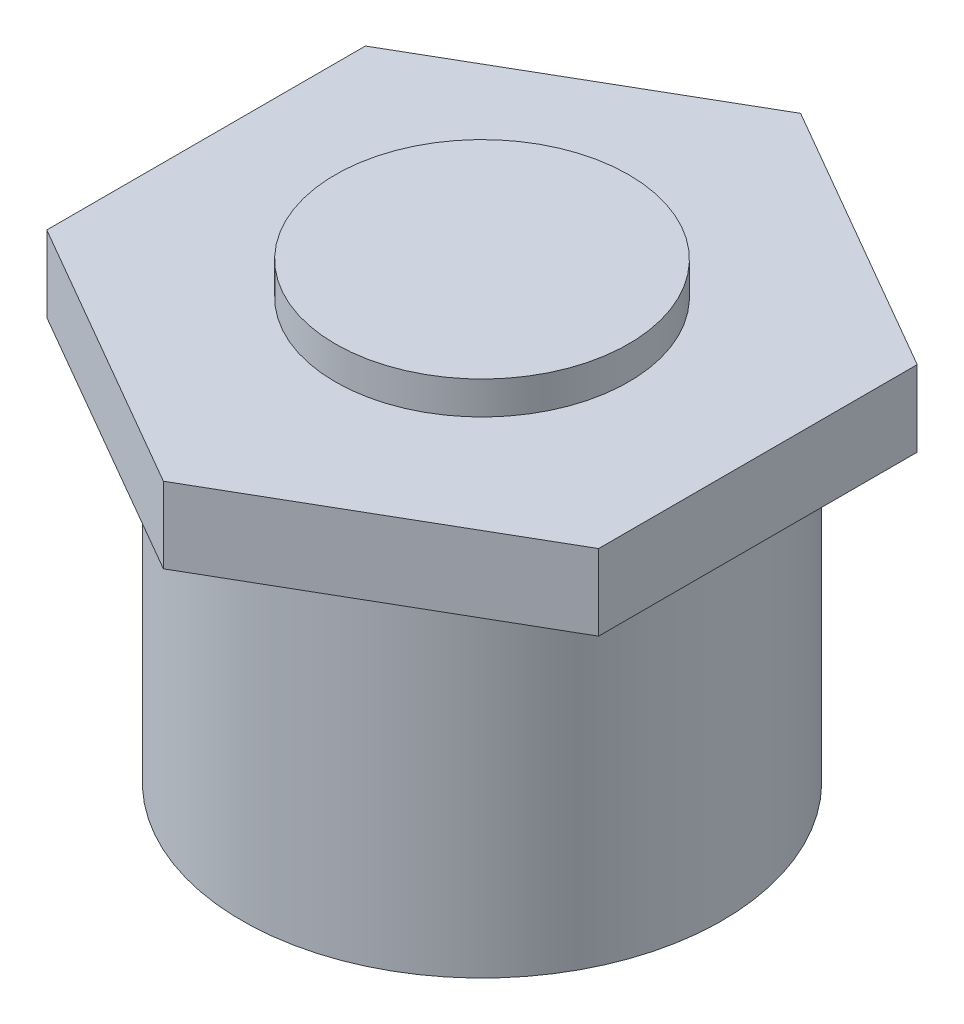
ISO-10303-21;
HEADER;
FILE_DESCRIPTION(('STEP AP214'),'2;1');
FILE_NAME('part.step','',(''),(''),'','','');
FILE_SCHEMA(('AUTOMOTIVE_DESIGN { 1 0 10303 214 1 1 1 1 }'));
ENDSEC;
DATA;
#1=APPLICATION_CONTEXT('core data for automotive mechanical design processes');
#2=APPLICATION_PROTOCOL_DEFINITION('international standard','automotive_design',2000,#1);
#3=PRODUCT_CONTEXT('',#1,'mechanical');
#4=PRODUCT('Part','Part','',(#3));
#5=PRODUCT_RELATED_PRODUCT_CATEGORY('part','',(#4));
#6=PRODUCT_DEFINITION_FORMATION('','',#4);
#7=PRODUCT_DEFINITION_CONTEXT('part definition',#1,'design');
#8=PRODUCT_DEFINITION('design','',#6,#7);
#9=PRODUCT_DEFINITION_SHAPE('','',#8);
#10=(LENGTH_UNIT() NAMED_UNIT(*) SI_UNIT(.MILLI.,.METRE.));
#11=(NAMED_UNIT(*) PLANE_ANGLE_UNIT() SI_UNIT($,.RADIAN.));
#12=(NAMED_UNIT(*) SI_UNIT($,.STERADIAN.) SOLID_ANGLE_UNIT());
#13=UNCERTAINTY_MEASURE_WITH_UNIT(LENGTH_MEASURE(1.E-05),#10,'distance_accuracy_value','');
#14=(GEOMETRIC_REPRESENTATION_CONTEXT(3) GLOBAL_UNCERTAINTY_ASSIGNED_CONTEXT((#13)) GLOBAL_UNIT_ASSIGNED_CONTEXT((#10,
#11,#12)) REPRESENTATION_CONTEXT('',''));
#15=CARTESIAN_POINT('',(0.,0.,0.));
#16=DIRECTION('',(0.,0.,1.));
#17=DIRECTION('',(1.,0.,0.));
#18=AXIS2_PLACEMENT_3D('',#15,#16,#17);
#19=CARTESIAN_POINT('',(10.9119200876839,3.,-6.30000000000013));
#20=DIRECTION('',(-0.499999999999995,0.,0.866025403784441));
#21=DIRECTION('',(0.866025403784442,0.,0.499999999999995));
#22=AXIS2_PLACEMENT_3D('',#19,#20,#21);
#23=PLANE('',#22);
#24=DIRECTION('',(-0.866025403784442,0.,-0.499999999999995));
#25=VECTOR('',#24,1.);
#26=CARTESIAN_POINT('',(10.9119200876839,0.,-6.30000000000013));
#27=LINE('',#26,#25);
#28=CARTESIAN_POINT('',(10.9119200876839,0.,-6.30000000000013));
#29=VERTEX_POINT('',#28);
#30=CARTESIAN_POINT('',(0.,0.,-12.6));
#31=VERTEX_POINT('',#30);
#32=EDGE_CURVE('E135',#29,#31,#27,.T.);
#33=ORIENTED_EDGE('',*,*,#32,.T.);
#34=DIRECTION('',(0.,-1.,0.));
#35=VECTOR('',#34,1.);
#36=CARTESIAN_POINT('',(0.,3.,-12.6));
#37=LINE('',#36,#35);
#38=CARTESIAN_POINT('',(0.,3.,-12.6));
#39=VERTEX_POINT('',#38);
#40=EDGE_CURVE('E46',#39,#31,#37,.T.);
#41=ORIENTED_EDGE('',*,*,#40,.F.);
#42=DIRECTION('',(-0.866025403784442,0.,-0.499999999999995));
#43=VECTOR('',#42,1.);
#44=CARTESIAN_POINT('',(10.9119200876839,3.,-6.30000000000013));
#45=LINE('',#44,#43);
#46=CARTESIAN_POINT('',(10.9119200876839,3.,-6.30000000000013));
#47=VERTEX_POINT('',#46);
#48=EDGE_CURVE('E152',#47,#39,#45,.T.);
#49=ORIENTED_EDGE('',*,*,#48,.F.);
#50=DIRECTION('',(0.,-1.,0.));
#51=VECTOR('',#50,1.);
#52=CARTESIAN_POINT('',(10.9119200876839,3.,-6.30000000000013));
#53=LINE('',#52,#51);
#54=EDGE_CURVE('E131',#47,#29,#53,.T.);
#55=ORIENTED_EDGE('',*,*,#54,.T.);
#56=EDGE_LOOP('',(#33,#41,#49,#55));
#57=FACE_BOUND('',#56,.T.);
#58=ADVANCED_FACE('F43',(#57),#23,.F.);
#59=CARTESIAN_POINT('',(0.,3.,-12.6));
#60=DIRECTION('',(0.500000000000001,0.,0.866025403784438));
#61=DIRECTION('',(0.866025403784438,0.,-0.500000000000001));
#62=AXIS2_PLACEMENT_3D('',#59,#60,#61);
#63=PLANE('',#62);
#64=DIRECTION('',(-0.866025403784438,0.,0.500000000000001));
#65=VECTOR('',#64,1.);
#66=CARTESIAN_POINT('',(0.,0.,-12.6));
#67=LINE('',#66,#65);
#68=CARTESIAN_POINT('',(-10.9119200876839,0.,-6.29999999999997));
#69=VERTEX_POINT('',#68);
#70=EDGE_CURVE('E139',#31,#69,#67,.T.);
#71=ORIENTED_EDGE('',*,*,#70,.T.);
#72=DIRECTION('',(0.,-1.,0.));
#73=VECTOR('',#72,1.);
#74=CARTESIAN_POINT('',(-10.9119200876839,3.,-6.29999999999997));
#75=LINE('',#74,#73);
#76=CARTESIAN_POINT('',(-10.9119200876839,3.,-6.29999999999997));
#77=VERTEX_POINT('',#76);
#78=EDGE_CURVE('E158',#77,#69,#75,.T.);
#79=ORIENTED_EDGE('',*,*,#78,.F.);
#80=DIRECTION('',(-0.866025403784438,0.,0.500000000000001));
#81=VECTOR('',#80,1.);
#82=CARTESIAN_POINT('',(0.,3.,-12.6));
#83=LINE('',#82,#81);
#84=EDGE_CURVE('E100',#39,#77,#83,.T.);
#85=ORIENTED_EDGE('',*,*,#84,.F.);
#86=ORIENTED_EDGE('',*,*,#40,.T.);
#87=EDGE_LOOP('',(#71,#79,#85,#86));
#88=FACE_BOUND('',#87,.T.);
#89=ADVANCED_FACE('F207',(#88),#63,.F.);
#90=CARTESIAN_POINT('',(-10.9119200876839,3.,-6.29999999999997));
#91=DIRECTION('',(1.,0.,0.));
#92=DIRECTION('',(0.,0.,-1.));
#93=AXIS2_PLACEMENT_3D('',#90,#91,#92);
#94=PLANE('',#93);
#95=DIRECTION('',(0.,0.,1.));
#96=VECTOR('',#95,1.);
#97=CARTESIAN_POINT('',(-10.9119200876839,0.,-6.29999999999997));
#98=LINE('',#97,#96);
#99=CARTESIAN_POINT('',(-10.9119200876839,0.,6.30000000000005));
#100=VERTEX_POINT('',#99);
#101=EDGE_CURVE('E143',#69,#100,#98,.T.);
#102=ORIENTED_EDGE('',*,*,#101,.T.);
#103=DIRECTION('',(0.,-1.,0.));
#104=VECTOR('',#103,1.);
#105=CARTESIAN_POINT('',(-10.9119200876839,3.,6.30000000000005));
#106=LINE('',#105,#104);
#107=CARTESIAN_POINT('',(-10.9119200876839,3.,6.30000000000005));
#108=VERTEX_POINT('',#107);
#109=EDGE_CURVE('E124',#108,#100,#106,.T.);
#110=ORIENTED_EDGE('',*,*,#109,.F.);
#111=DIRECTION('',(0.,0.,1.));
#112=VECTOR('',#111,1.);
#113=CARTESIAN_POINT('',(-10.9119200876839,3.,-6.29999999999997));
#114=LINE('',#113,#112);
#115=EDGE_CURVE('E113',#77,#108,#114,.T.);
#116=ORIENTED_EDGE('',*,*,#115,.F.);
#117=ORIENTED_EDGE('',*,*,#78,.T.);
#118=EDGE_LOOP('',(#102,#110,#116,#117));
#119=FACE_BOUND('',#118,.T.);
#120=ADVANCED_FACE('F212',(#119),#94,.F.);
#121=CARTESIAN_POINT('',(-10.9119200876839,3.,6.30000000000005));
#122=DIRECTION('',(0.499999999999995,0.,-0.866025403784442));
#123=DIRECTION('',(-0.866025403784442,0.,-0.499999999999995));
#124=AXIS2_PLACEMENT_3D('',#121,#122,#123);
#125=PLANE('',#124);
#126=DIRECTION('',(0.866025403784441,0.,0.499999999999995));
#127=VECTOR('',#126,1.);
#128=CARTESIAN_POINT('',(-10.9119200876839,0.,6.30000000000005));
#129=LINE('',#128,#127);
#130=CARTESIAN_POINT('',(0.,0.,12.6));
#131=VERTEX_POINT('',#130);
#132=EDGE_CURVE('E122',#100,#131,#129,.T.);
#133=ORIENTED_EDGE('',*,*,#132,.T.);
#134=DIRECTION('',(0.,-1.,0.));
#135=VECTOR('',#134,1.);
#136=CARTESIAN_POINT('',(0.,3.,12.6));
#137=LINE('',#136,#135);
#138=CARTESIAN_POINT('',(0.,3.,12.6));
#139=VERTEX_POINT('',#138);
#140=EDGE_CURVE('E119',#139,#131,#137,.T.);
#141=ORIENTED_EDGE('',*,*,#140,.F.);
#142=DIRECTION('',(0.866025403784441,0.,0.499999999999995));
#143=VECTOR('',#142,1.);
#144=CARTESIAN_POINT('',(-10.9119200876839,3.,6.30000000000005));
#145=LINE('',#144,#143);
#146=EDGE_CURVE('E107',#108,#139,#145,.T.);
#147=ORIENTED_EDGE('',*,*,#146,.F.);
#148=ORIENTED_EDGE('',*,*,#109,.T.);
#149=EDGE_LOOP('',(#133,#141,#147,#148));
#150=FACE_BOUND('',#149,.T.);
#151=ADVANCED_FACE('F120',(#150),#125,.F.);
#152=CARTESIAN_POINT('',(0.,3.,12.6));
#153=DIRECTION('',(-0.500000000000007,0.,-0.866025403784434));
#154=DIRECTION('',(-0.866025403784435,0.,0.500000000000007));
#155=AXIS2_PLACEMENT_3D('',#152,#153,#154);
#156=PLANE('',#155);
#157=DIRECTION('',(0.866025403784435,0.,-0.500000000000007));
#158=VECTOR('',#157,1.);
#159=CARTESIAN_POINT('',(0.,0.,12.6));
#160=LINE('',#159,#158);
#161=CARTESIAN_POINT('',(10.911920087684,0.,6.2999999999999));
#162=VERTEX_POINT('',#161);
#163=EDGE_CURVE('E85',#131,#162,#160,.T.);
#164=ORIENTED_EDGE('',*,*,#163,.T.);
#165=DIRECTION('',(0.,-1.,0.));
#166=VECTOR('',#165,1.);
#167=CARTESIAN_POINT('',(10.911920087684,3.,6.2999999999999));
#168=LINE('',#167,#166);
#169=CARTESIAN_POINT('',(10.911920087684,3.,6.2999999999999));
#170=VERTEX_POINT('',#169);
#171=EDGE_CURVE('E125',#170,#162,#168,.T.);
#172=ORIENTED_EDGE('',*,*,#171,.F.);
#173=DIRECTION('',(0.866025403784435,0.,-0.500000000000007));
#174=VECTOR('',#173,1.);
#175=CARTESIAN_POINT('',(0.,3.,12.6));
#176=LINE('',#175,#174);
#177=EDGE_CURVE('E111',#139,#170,#176,.T.);
#178=ORIENTED_EDGE('',*,*,#177,.F.);
#179=ORIENTED_EDGE('',*,*,#140,.T.);
#180=EDGE_LOOP('',(#164,#172,#178,#179));
#181=FACE_BOUND('',#180,.T.);
#182=ADVANCED_FACE('F127',(#181),#156,.F.);
#183=CARTESIAN_POINT('',(10.911920087684,3.,6.2999999999999));
#184=DIRECTION('',(-1.,0.,0.));
#185=DIRECTION('',(0.,0.,1.));
#186=AXIS2_PLACEMENT_3D('',#183,#184,#185);
#187=PLANE('',#186);
#188=DIRECTION('',(0.,0.,-1.));
#189=VECTOR('',#188,1.);
#190=CARTESIAN_POINT('',(10.911920087684,0.,6.2999999999999));
#191=LINE('',#190,#189);
#192=EDGE_CURVE('E91',#162,#29,#191,.T.);
#193=ORIENTED_EDGE('',*,*,#192,.T.);
#194=ORIENTED_EDGE('',*,*,#54,.F.);
#195=DIRECTION('',(0.,0.,-1.));
#196=VECTOR('',#195,1.);
#197=CARTESIAN_POINT('',(10.911920087684,3.,6.2999999999999));
#198=LINE('',#197,#196);
#199=EDGE_CURVE('E62',#170,#47,#198,.T.);
#200=ORIENTED_EDGE('',*,*,#199,.F.);
#201=ORIENTED_EDGE('',*,*,#171,.T.);
#202=EDGE_LOOP('',(#193,#194,#200,#201));
#203=FACE_BOUND('',#202,.T.);
#204=ADVANCED_FACE('F195',(#203),#187,.F.);
#205=CARTESIAN_POINT('',(0.,3.,0.));
#206=DIRECTION('',(0.,1.,0.));
#207=DIRECTION('',(0.,0.,1.));
#208=AXIS2_PLACEMENT_3D('',#205,#206,#207);
#209=PLANE('',#208);
#210=CARTESIAN_POINT('',(0.,3.,0.));
#211=DIRECTION('',(0.,1.,0.));
#212=DIRECTION('',(0.,0.,1.));
#213=AXIS2_PLACEMENT_3D('',#210,#211,#212);
#214=CIRCLE('',#213,5.8);
#215=CARTESIAN_POINT('',(0.,3.,5.8));
#216=VERTEX_POINT('',#215);
#217=EDGE_CURVE('E11',#216,#216,#214,.T.);
#218=ORIENTED_EDGE('',*,*,#217,.F.);
#219=EDGE_LOOP('',(#218));
#220=FACE_BOUND('',#219,.T.);
#221=ORIENTED_EDGE('',*,*,#48,.T.);
#222=ORIENTED_EDGE('',*,*,#84,.T.);
#223=ORIENTED_EDGE('',*,*,#115,.T.);
#224=ORIENTED_EDGE('',*,*,#146,.T.);
#225=ORIENTED_EDGE('',*,*,#177,.T.);
#226=ORIENTED_EDGE('',*,*,#199,.T.);
#227=EDGE_LOOP('',(#221,#222,#223,#224,#225,#226));
#228=FACE_BOUND('',#227,.T.);
#229=ADVANCED_FACE('F109',(#220,#228),#209,.T.);
#230=CARTESIAN_POINT('',(0.,0.,0.));
#231=DIRECTION('',(0.,1.,0.));
#232=DIRECTION('',(0.,0.,1.));
#233=AXIS2_PLACEMENT_3D('',#230,#231,#232);
#234=PLANE('',#233);
#235=CARTESIAN_POINT('',(0.,0.,0.));
#236=DIRECTION('',(0.,-1.,0.));
#237=DIRECTION('',(0.,0.,-1.));
#238=AXIS2_PLACEMENT_3D('',#235,#236,#237);
#239=CIRCLE('',#238,9.5);
#240=CARTESIAN_POINT('',(0.,0.,-9.5));
#241=VERTEX_POINT('',#240);
#242=EDGE_CURVE('E53',#241,#241,#239,.T.);
#243=ORIENTED_EDGE('',*,*,#242,.F.);
#244=EDGE_LOOP('',(#243));
#245=FACE_BOUND('',#244,.T.);
#246=ORIENTED_EDGE('',*,*,#32,.F.);
#247=ORIENTED_EDGE('',*,*,#192,.F.);
#248=ORIENTED_EDGE('',*,*,#163,.F.);
#249=ORIENTED_EDGE('',*,*,#132,.F.);
#250=ORIENTED_EDGE('',*,*,#101,.F.);
#251=ORIENTED_EDGE('',*,*,#70,.F.);
#252=EDGE_LOOP('',(#246,#247,#248,#249,#250,#251));
#253=FACE_BOUND('',#252,.T.);
#254=ADVANCED_FACE('F194',(#245,#253),#234,.F.);
#255=CARTESIAN_POINT('',(0.,-13.6,0.));
#256=DIRECTION('',(0.,1.,0.));
#257=DIRECTION('',(0.,0.,1.));
#258=AXIS2_PLACEMENT_3D('',#255,#256,#257);
#259=CYLINDRICAL_SURFACE('',#258,9.5);
#260=CARTESIAN_POINT('',(0.,-13.6,0.));
#261=DIRECTION('',(0.,-1.,0.));
#262=DIRECTION('',(0.,0.,-1.));
#263=AXIS2_PLACEMENT_3D('',#260,#261,#262);
#264=CIRCLE('',#263,9.5);
#265=CARTESIAN_POINT('',(0.,-13.6,-9.5));
#266=VERTEX_POINT('',#265);
#267=EDGE_CURVE('E140',#266,#266,#264,.T.);
#268=ORIENTED_EDGE('',*,*,#267,.F.);
#269=EDGE_LOOP('',(#268));
#270=FACE_BOUND('',#269,.T.);
#271=ORIENTED_EDGE('',*,*,#242,.T.);
#272=EDGE_LOOP('',(#271));
#273=FACE_BOUND('',#272,.T.);
#274=ADVANCED_FACE('F201',(#270,#273),#259,.T.);
#275=CARTESIAN_POINT('',(0.,-13.6,0.));
#276=DIRECTION('',(0.,-1.,0.));
#277=DIRECTION('',(0.,0.,-1.));
#278=AXIS2_PLACEMENT_3D('',#275,#276,#277);
#279=PLANE('',#278);
#280=ORIENTED_EDGE('',*,*,#267,.T.);
#281=EDGE_LOOP('',(#280));
#282=FACE_BOUND('',#281,.T.);
#283=ADVANCED_FACE('F189',(#282),#279,.T.);
#284=CARTESIAN_POINT('',(0.,4.3,0.));
#285=DIRECTION('',(0.,-1.,0.));
#286=DIRECTION('',(0.,0.,-1.));
#287=AXIS2_PLACEMENT_3D('',#284,#285,#286);
#288=CYLINDRICAL_SURFACE('',#287,5.8);
#289=CARTESIAN_POINT('',(0.,4.3,0.));
#290=DIRECTION('',(0.,1.,0.));
#291=DIRECTION('',(0.,0.,1.));
#292=AXIS2_PLACEMENT_3D('',#289,#290,#291);
#293=CIRCLE('',#292,5.8);
#294=CARTESIAN_POINT('',(0.,4.3,5.8));
#295=VERTEX_POINT('',#294);
#296=EDGE_CURVE('E179',#295,#295,#293,.T.);
#297=ORIENTED_EDGE('',*,*,#296,.F.);
#298=EDGE_LOOP('',(#297));
#299=FACE_BOUND('',#298,.T.);
#300=ORIENTED_EDGE('',*,*,#217,.T.);
#301=EDGE_LOOP('',(#300));
#302=FACE_BOUND('',#301,.T.);
#303=ADVANCED_FACE('F186',(#299,#302),#288,.T.);
#304=CARTESIAN_POINT('',(0.,4.3,0.));
#305=DIRECTION('',(0.,1.,0.));
#306=DIRECTION('',(0.,0.,1.));
#307=AXIS2_PLACEMENT_3D('',#304,#305,#306);
#308=PLANE('',#307);
#309=ORIENTED_EDGE('',*,*,#296,.T.);
#310=EDGE_LOOP('',(#309));
#311=FACE_BOUND('',#310,.T.);
#312=ADVANCED_FACE('F184',(#311),#308,.T.);
#313=CLOSED_SHELL('',(#58,#89,#120,#151,#182,#204,#229,#254,#274,#283,#303,#312));
#314=MANIFOLD_SOLID_BREP('B2',#313);
#315=ADVANCED_BREP_SHAPE_REPRESENTATION('',(#18,#314),#14);
#316=SHAPE_DEFINITION_REPRESENTATION(#9,#315);
ENDSEC;
END-ISO-10303-21;
